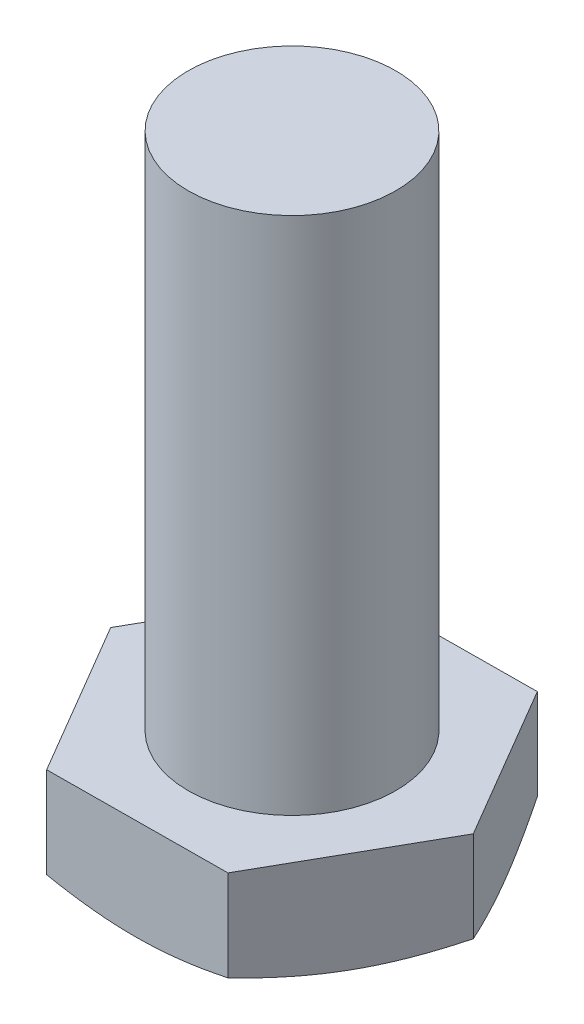
ISO-10303-21;
HEADER;
FILE_DESCRIPTION(('STEP AP214'),'2;1');
FILE_NAME('part.step','',(''),(''),'','','');
FILE_SCHEMA(('AUTOMOTIVE_DESIGN { 1 0 10303 214 1 1 1 1 }'));
ENDSEC;
DATA;
#1=APPLICATION_CONTEXT('core data for automotive mechanical design processes');
#2=APPLICATION_PROTOCOL_DEFINITION('international standard','automotive_design',2000,#1);
#3=PRODUCT_CONTEXT('',#1,'mechanical');
#4=PRODUCT('Part','Part','',(#3));
#5=PRODUCT_RELATED_PRODUCT_CATEGORY('part','',(#4));
#6=PRODUCT_DEFINITION_FORMATION('','',#4);
#7=PRODUCT_DEFINITION_CONTEXT('part definition',#1,'design');
#8=PRODUCT_DEFINITION('design','',#6,#7);
#9=PRODUCT_DEFINITION_SHAPE('','',#8);
#10=(LENGTH_UNIT() NAMED_UNIT(*) SI_UNIT(.MILLI.,.METRE.));
#11=(NAMED_UNIT(*) PLANE_ANGLE_UNIT() SI_UNIT($,.RADIAN.));
#12=(NAMED_UNIT(*) SI_UNIT($,.STERADIAN.) SOLID_ANGLE_UNIT());
#13=UNCERTAINTY_MEASURE_WITH_UNIT(LENGTH_MEASURE(1.E-05),#10,'distance_accuracy_value','');
#14=(GEOMETRIC_REPRESENTATION_CONTEXT(3) GLOBAL_UNCERTAINTY_ASSIGNED_CONTEXT((#13)) GLOBAL_UNIT_ASSIGNED_CONTEXT((#10,
#11,#12)) REPRESENTATION_CONTEXT('',''));
#15=CARTESIAN_POINT('',(0.,0.,0.));
#16=DIRECTION('',(0.,0.,1.));
#17=DIRECTION('',(1.,0.,0.));
#18=AXIS2_PLACEMENT_3D('',#15,#16,#17);
#19=CARTESIAN_POINT('',(6.92800926013698,4.,-0.0518429499176964));
#20=DIRECTION('',(-0.862259714880802,0.,0.506466370150751));
#21=DIRECTION('',(0.506466370150751,0.,0.862259714880802));
#22=AXIS2_PLACEMENT_3D('',#19,#20,#21);
#23=PLANE('',#22);
#24=DIRECTION('',(0.,-1.,0.));
#25=VECTOR('',#24,1.);
#26=CARTESIAN_POINT('',(6.92800926013698,4.,-0.0518429499176964));
#27=LINE('',#26,#25);
#28=CARTESIAN_POINT('',(6.92800926013698,4.,-0.0518429499176964));
#29=VERTEX_POINT('',#28);
#30=CARTESIAN_POINT('',(6.92800926013698,0.499999999999955,-0.0518429499176964));
#31=VERTEX_POINT('',#30);
#32=EDGE_CURVE('E100',#29,#31,#27,.T.);
#33=ORIENTED_EDGE('',*,*,#32,.T.);
#34=CARTESIAN_POINT('',(6.92812673434143,0.500048323854297,-0.0516429499177046));
#35=CARTESIAN_POINT('',(6.80927083368725,0.451153523496953,-0.253995289678116));
#36=CARTESIAN_POINT('',(6.69001316516403,0.405818753398016,-0.457031639806499));
#37=CARTESIAN_POINT('',(6.45068704253087,0.323588255555171,-0.864484703676812));
#38=CARTESIAN_POINT('',(6.33061816090486,0.286697404628385,-1.06890214526545));
#39=CARTESIAN_POINT('',(6.08980212413212,0.222733872218398,-1.47889179007559));
#40=CARTESIAN_POINT('',(5.96905498410254,0.195660972785808,-1.68446396756013));
#41=CARTESIAN_POINT('',(5.72707612635943,0.152526784459337,-2.09643331672472));
#42=CARTESIAN_POINT('',(5.60584451749911,0.136463148037688,-2.30283030308202));
#43=CARTESIAN_POINT('',(5.36527958055234,0.116319318782393,-2.71239245008163));
#44=CARTESIAN_POINT('',(5.24595077926599,0.112031358764849,-2.91554990384033));
#45=CARTESIAN_POINT('',(5.00732161217629,0.115061975267654,-3.32181639990751));
#46=CARTESIAN_POINT('',(4.8880212494557,0.122381491112353,-3.52492543696759));
#47=CARTESIAN_POINT('',(4.64982253013155,0.148247832990973,-3.93045909510224));
#48=CARTESIAN_POINT('',(4.53092395123452,0.166786827535181,-4.13288409463177));
#49=CARTESIAN_POINT('',(4.29367346446322,0.214215666129992,-4.53680338549773));
#50=CARTESIAN_POINT('',(4.17532150449906,0.243104502384013,-4.73829776551728));
#51=CARTESIAN_POINT('',(4.00393845593336,0.291718667390088,-5.03007764923923));
#52=CARTESIAN_POINT('',(3.95063367882227,0.307796950885785,-5.12082910801805));
#53=CARTESIAN_POINT('',(3.8441748819999,0.341709113385547,-5.30207536088827));
#54=CARTESIAN_POINT('',(3.79102084121377,0.35954273311736,-5.39257019085966));
#55=CARTESIAN_POINT('',(3.68463447785271,0.396928978859127,-5.57369312565906));
#56=CARTESIAN_POINT('',(3.63140279074218,0.416488622266113,-5.66432014860807));
#57=CARTESIAN_POINT('',(3.52508546419802,0.457145192961709,-5.84532554812862));
#58=CARTESIAN_POINT('',(3.47199983731745,0.478242248347747,-5.93570390332856));
#59=CARTESIAN_POINT('',(3.4189898442282,0.500048323854307,-6.02595349189131));
#60=B_SPLINE_CURVE_WITH_KNOTS('',3,(#34,#35,#36,#37,#38,#39,#40,#41,#42,#43,#44,#45,#46,#47,#48,
#49,#50,#51,#52,#53,#54,#55,#56,#57,#58,#59),.UNSPECIFIED.,.F.,.F.,(4,2,2,2,2,2,2,2,2,2,2,2,4),
(0.,0.71919702680669,1.43880838629071,2.15840377009404,2.87784566531589,3.58450976947285,
4.29123106269326,4.99745961403513,5.70361941636778,6.02301671113098,6.34236689985319,
6.6630812028558,6.98382225844898),.UNSPECIFIED.);
#61=CARTESIAN_POINT('',(3.41910731843264,0.499999999999969,-6.02575349189131));
#62=VERTEX_POINT('',#61);
#63=EDGE_CURVE('E51',#31,#62,#60,.T.);
#64=ORIENTED_EDGE('',*,*,#63,.T.);
#65=DIRECTION('',(0.,-1.,0.));
#66=VECTOR('',#65,1.);
#67=CARTESIAN_POINT('',(3.41910731843264,4.,-6.02575349189131));
#68=LINE('',#67,#66);
#69=CARTESIAN_POINT('',(3.41910731843264,4.,-6.02575349189131));
#70=VERTEX_POINT('',#69);
#71=EDGE_CURVE('E11',#70,#62,#68,.T.);
#72=ORIENTED_EDGE('',*,*,#71,.F.);
#73=DIRECTION('',(-0.506466370150751,0.,-0.862259714880802));
#74=VECTOR('',#73,1.);
#75=CARTESIAN_POINT('',(6.92800926013698,4.,-0.0518429499176964));
#76=LINE('',#75,#74);
#77=EDGE_CURVE('E107',#29,#70,#76,.T.);
#78=ORIENTED_EDGE('',*,*,#77,.F.);
#79=EDGE_LOOP('',(#33,#64,#72,#78));
#80=FACE_BOUND('',#79,.T.);
#81=ADVANCED_FACE('F36',(#80),#23,.F.);
#82=CARTESIAN_POINT('',(3.41910731843264,4.,-6.02575349189131));
#83=DIRECTION('',(0.00748288527264197,0.,0.999972002822077));
#84=DIRECTION('',(0.999972002822077,0.,-0.00748288527264197));
#85=AXIS2_PLACEMENT_3D('',#82,#83,#84);
#86=PLANE('',#85);
#87=ORIENTED_EDGE('',*,*,#71,.T.);
#88=CARTESIAN_POINT('',(3.41930731843264,0.500041668735365,-6.02575498851027));
#89=CARTESIAN_POINT('',(3.18463793493822,0.451147379088578,-6.02399893527204));
#90=CARTESIAN_POINT('',(2.94917530203572,0.405813123250812,-6.02223694607332));
#91=CARTESIAN_POINT('',(2.47664923052112,0.323583645094771,-6.01870098869501));
#92=CARTESIAN_POINT('',(2.23958494783807,0.286693299516301,-6.01692701419917));
#93=CARTESIAN_POINT('',(1.76411722102667,0.222730752709938,-6.01336904413548));
#94=CARTESIAN_POINT('',(1.52571380679544,0.195658333167209,-6.01158504879135));
#95=CARTESIAN_POINT('',(1.04795024501058,0.152525053498622,-6.00800989877695));
#96=CARTESIAN_POINT('',(0.808590312370648,0.136461845881854,-6.00621874571491));
#97=CARTESIAN_POINT('',(0.333618388488675,0.116318789353803,-6.00266448579152));
#98=CARTESIAN_POINT('',(0.0980153345379292,0.112031176860927,-6.00090144580878));
#99=CARTESIAN_POINT('',(-0.373134615199054,0.115062400399776,-5.99737578608017));
#100=CARTESIAN_POINT('',(-0.608681504897423,0.122382175753056,-5.99561316637985));
#101=CARTESIAN_POINT('',(-1.07898155645899,0.148248938632609,-5.99209386651983));
#102=CARTESIAN_POINT('',(-1.3137351572167,0.166788094893103,-5.99033718307585));
#103=CARTESIAN_POINT('',(-1.78216300726955,0.214217160166547,-5.98683189307716));
#104=CARTESIAN_POINT('',(-2.01583735941227,0.243106061383196,-5.98508328575284));
#105=CARTESIAN_POINT('',(-2.35421319805392,0.291719797015002,-5.98255118728164));
#106=CARTESIAN_POINT('',(-2.45945506356584,0.307797563816831,-5.98176365242739));
#107=CARTESIAN_POINT('',(-2.66964115748647,0.341708573083566,-5.98019080996553));
#108=CARTESIAN_POINT('',(-2.774585427503,0.359541556292345,-5.97940550204657));
#109=CARTESIAN_POINT('',(-2.98462851415085,0.39692641493938,-5.97783372972168));
#110=CARTESIAN_POINT('',(-3.08972607625419,0.416485307019949,-5.9770472747035));
#111=CARTESIAN_POINT('',(-3.29963286330454,0.457140277774729,-5.97547652232142));
#112=CARTESIAN_POINT('',(-3.40444206346648,0.478236484548056,-5.97469222514298));
#113=CARTESIAN_POINT('',(-3.50910194170434,0.500041668735351,-5.97390904535465));
#114=B_SPLINE_CURVE_WITH_KNOTS('',3,(#88,#89,#90,#91,#92,#93,#94,#95,#96,#97,#98,#99,#100,#101,
#102,#103,#104,#105,#106,#107,#108,#109,#110,#111,#112,#113),.UNSPECIFIED.,.F.,.F.,(4,2,2,2,2,2,
2,2,2,2,2,2,4),(0.,0.719194265188102,1.43880285535953,2.15839544308146,2.87783454451759,
3.58449604508288,4.29121473476451,4.99744069417608,5.70359790420751,6.02298431424008,
6.34232361955401,6.66302693575096,6.98375700567054),.UNSPECIFIED.);
#115=CARTESIAN_POINT('',(-3.50890194170433,0.499999999999959,-5.97391054197362));
#116=VERTEX_POINT('',#115);
#117=EDGE_CURVE('E88',#62,#116,#114,.T.);
#118=ORIENTED_EDGE('',*,*,#117,.T.);
#119=DIRECTION('',(0.,-1.,0.));
#120=VECTOR('',#119,1.);
#121=CARTESIAN_POINT('',(-3.50890194170434,4.,-5.97391054197362));
#122=LINE('',#121,#120);
#123=CARTESIAN_POINT('',(-3.50890194170434,4.,-5.97391054197362));
#124=VERTEX_POINT('',#123);
#125=EDGE_CURVE('E44',#124,#116,#122,.T.);
#126=ORIENTED_EDGE('',*,*,#125,.F.);
#127=DIRECTION('',(-0.999972002822077,0.,0.00748288527264197));
#128=VECTOR('',#127,1.);
#129=CARTESIAN_POINT('',(3.41910731843264,4.,-6.02575349189131));
#130=LINE('',#129,#128);
#131=EDGE_CURVE('E104',#70,#124,#130,.T.);
#132=ORIENTED_EDGE('',*,*,#131,.F.);
#133=EDGE_LOOP('',(#87,#118,#126,#132));
#134=FACE_BOUND('',#133,.T.);
#135=ADVANCED_FACE('F103',(#134),#86,.F.);
#136=CARTESIAN_POINT('',(-3.50890194170434,4.,-5.97391054197362));
#137=DIRECTION('',(0.869742600153445,0.,0.493505632671326));
#138=DIRECTION('',(0.493505632671326,0.,-0.869742600153445));
#139=AXIS2_PLACEMENT_3D('',#136,#137,#138);
#140=PLANE('',#139);
#141=ORIENTED_EDGE('',*,*,#125,.T.);
#142=CARTESIAN_POINT('',(-3.50878845855827,0.50004790808662,-5.97411054197361));
#143=CARTESIAN_POINT('',(-3.624602749278,0.45115313963507,-5.77000218803191));
#144=CARTESIAN_POINT('',(-3.74080852626781,0.405818401663737,-5.56520388799047));
#145=CARTESIAN_POINT('',(-3.97401011688449,0.323587967524099,-5.15421494611155));
#146=CARTESIAN_POINT('',(-4.09100634708643,0.286697148168085,-4.94802357011208));
#147=CARTESIAN_POINT('',(-4.32565972276912,0.222733677331985,-4.5344760367307));
#148=CARTESIAN_POINT('',(-4.44331685351804,0.195660807879679,-4.3271199053118));
#149=CARTESIAN_POINT('',(-4.67910329144384,0.152526676320006,-3.91157548995742));
#150=CARTESIAN_POINT('',(-4.79723249255332,0.136463066687173,-3.70338739295258));
#151=CARTESIAN_POINT('',(-5.03164119328928,0.116319285706588,-3.29027106888326));
#152=CARTESIAN_POINT('',(-5.14791628197317,0.112031347399988,-3.08535061555917));
#153=CARTESIAN_POINT('',(-5.38043875107804,0.115062001826173,-2.67555854129514));
#154=CARTESIAN_POINT('',(-5.49668612849511,0.122381533883134,-2.47068692564921));
#155=CARTESIAN_POINT('',(-5.72878916466055,0.148247902062853,-2.06163405003091));
#156=CARTESIAN_POINT('',(-5.84464504001367,0.166786906709888,-1.85745240831946));
#157=CARTESIAN_POINT('',(-6.07582410932302,0.214215759465787,-1.45002790993267));
#158=CARTESIAN_POINT('',(-6.19114735403614,0.243104599778086,-1.24678496380457));
#159=CARTESIAN_POINT('',(-6.35814448332842,0.291718737959834,-0.95247319138847));
#160=CARTESIAN_POINT('',(-6.4100850527656,0.307796989176172,-0.860934366043753));
#161=CARTESIAN_POINT('',(-6.5138192928088,0.341709079630011,-0.678115606363659));
#162=CARTESIAN_POINT('',(-6.56561298395029,0.359542659596266,-0.586835635837061));
#163=CARTESIAN_POINT('',(-6.66927664432829,0.396928818681863,-0.404141264081769));
#164=CARTESIAN_POINT('',(-6.72114599436656,0.416488415151085,-0.312727954113328));
#165=CARTESIAN_POINT('',(-6.82474238484224,0.457144885893216,-0.130152137235407));
#166=CARTESIAN_POINT('',(-6.87646941304781,0.478241888263657,-0.0389896518830002));
#167=CARTESIAN_POINT('',(-6.92812274328304,0.500047908086592,0.0520429499177022));
#168=B_SPLINE_CURVE_WITH_KNOTS('',3,(#142,#143,#144,#145,#146,#147,#148,#149,#150,#151,#152,
#153,#154,#155,#156,#157,#158,#159,#160,#161,#162,#163,#164,#165,#166,#167),.UNSPECIFIED.,.F.,
.F.,(4,2,2,2,2,2,2,2,2,2,2,2,4),(0.,0.719196854278306,1.43880804075327,2.1584032498752,
2.87784497055906,3.58450891206013,4.29123004262796,4.99745843204247,5.70361807242459,
6.0230146871868,6.34236419599061,6.66307781261516,6.98381818190101),.UNSPECIFIED.);
#169=CARTESIAN_POINT('',(-6.92800926013699,0.499999999999931,0.0518429499176826));
#170=VERTEX_POINT('',#169);
#171=EDGE_CURVE('E91',#116,#170,#168,.T.);
#172=ORIENTED_EDGE('',*,*,#171,.T.);
#173=DIRECTION('',(0.,-1.,0.));
#174=VECTOR('',#173,1.);
#175=CARTESIAN_POINT('',(-6.92800926013697,4.,0.0518429499176964));
#176=LINE('',#175,#174);
#177=CARTESIAN_POINT('',(-6.92800926013697,4.,0.0518429499176964));
#178=VERTEX_POINT('',#177);
#179=EDGE_CURVE('E129',#178,#170,#176,.T.);
#180=ORIENTED_EDGE('',*,*,#179,.F.);
#181=DIRECTION('',(-0.493505632671326,0.,0.869742600153445));
#182=VECTOR('',#181,1.);
#183=CARTESIAN_POINT('',(-3.50890194170434,4.,-5.97391054197362));
#184=LINE('',#183,#182);
#185=EDGE_CURVE('E106',#124,#178,#184,.T.);
#186=ORIENTED_EDGE('',*,*,#185,.F.);
#187=EDGE_LOOP('',(#141,#172,#180,#186));
#188=FACE_BOUND('',#187,.T.);
#189=ADVANCED_FACE('F132',(#188),#140,.F.);
#190=CARTESIAN_POINT('',(-6.92800926013697,4.,0.0518429499176964));
#191=DIRECTION('',(0.862259714880802,0.,-0.506466370150751));
#192=DIRECTION('',(-0.506466370150751,0.,-0.862259714880802));
#193=AXIS2_PLACEMENT_3D('',#190,#191,#192);
#194=PLANE('',#193);
#195=ORIENTED_EDGE('',*,*,#179,.T.);
#196=CARTESIAN_POINT('',(-6.92812673434142,0.500048323854266,0.0516429499177046));
#197=CARTESIAN_POINT('',(-6.80927083368724,0.451153523496923,0.253995289678117));
#198=CARTESIAN_POINT('',(-6.69001316516403,0.405818753397986,0.457031639806499));
#199=CARTESIAN_POINT('',(-6.45068704253086,0.323588255555139,0.864484703676813));
#200=CARTESIAN_POINT('',(-6.33061816090485,0.286697404628352,1.06890214526545));
#201=CARTESIAN_POINT('',(-6.08980212413211,0.222733872218363,1.47889179007559));
#202=CARTESIAN_POINT('',(-5.96905498410252,0.195660972785772,1.68446396756013));
#203=CARTESIAN_POINT('',(-5.72707612635942,0.152526784459301,2.09643331672472));
#204=CARTESIAN_POINT('',(-5.6058445174991,0.136463148037652,2.30283030308202));
#205=CARTESIAN_POINT('',(-5.36527958055232,0.116319318782355,2.71239245008164));
#206=CARTESIAN_POINT('',(-5.24595077926598,0.11203135876481,2.91554990384033));
#207=CARTESIAN_POINT('',(-5.00732161217628,0.115061975267614,3.32181639990751));
#208=CARTESIAN_POINT('',(-4.88802124945568,0.122381491112312,3.52492543696759));
#209=CARTESIAN_POINT('',(-4.64982253013153,0.148247832990931,3.93045909510225));
#210=CARTESIAN_POINT('',(-4.5309239512345,0.166786827535138,4.13288409463177));
#211=CARTESIAN_POINT('',(-4.2936734644632,0.214215666129948,4.53680338549774));
#212=CARTESIAN_POINT('',(-4.17532150449905,0.243104502383969,4.73829776551729));
#213=CARTESIAN_POINT('',(-4.00393845593335,0.291718667390043,5.03007764923924));
#214=CARTESIAN_POINT('',(-3.95063367882225,0.307796950885739,5.12082910801806));
#215=CARTESIAN_POINT('',(-3.84417488199989,0.341709113385501,5.30207536088828));
#216=CARTESIAN_POINT('',(-3.79102084121375,0.359542733117313,5.39257019085967));
#217=CARTESIAN_POINT('',(-3.6846344778527,0.39692897885908,5.57369312565908));
#218=CARTESIAN_POINT('',(-3.63140279074216,0.416488622266066,5.66432014860808));
#219=CARTESIAN_POINT('',(-3.525085464198,0.457145192961661,5.84532554812863));
#220=CARTESIAN_POINT('',(-3.47199983731743,0.478242248347697,5.93570390332857));
#221=CARTESIAN_POINT('',(-3.41898984422818,0.500048323854255,6.02595349189132));
#222=B_SPLINE_CURVE_WITH_KNOTS('',3,(#196,#197,#198,#199,#200,#201,#202,#203,#204,#205,#206,
#207,#208,#209,#210,#211,#212,#213,#214,#215,#216,#217,#218,#219,#220,#221),.UNSPECIFIED.,.F.,
.F.,(4,2,2,2,2,2,2,2,2,2,2,2,4),(0.,0.719197026806691,1.43880838629071,2.15840377009404,
2.87784566531589,3.58450976947285,4.29123106269327,4.99745961403514,5.70361941636779,
6.02301671113099,6.3423668998532,6.66308120285581,6.98382225844899),.UNSPECIFIED.);
#223=CARTESIAN_POINT('',(-3.41910731843265,0.499999999999921,6.02575349189131));
#224=VERTEX_POINT('',#223);
#225=EDGE_CURVE('E141',#170,#224,#222,.T.);
#226=ORIENTED_EDGE('',*,*,#225,.T.);
#227=DIRECTION('',(0.,-1.,0.));
#228=VECTOR('',#227,1.);
#229=CARTESIAN_POINT('',(-3.41910731843263,4.,6.02575349189131));
#230=LINE('',#229,#228);
#231=CARTESIAN_POINT('',(-3.41910731843263,4.,6.02575349189131));
#232=VERTEX_POINT('',#231);
#233=EDGE_CURVE('E126',#232,#224,#230,.T.);
#234=ORIENTED_EDGE('',*,*,#233,.F.);
#235=DIRECTION('',(0.506466370150751,0.,0.862259714880802));
#236=VECTOR('',#235,1.);
#237=CARTESIAN_POINT('',(-6.92800926013697,4.,0.0518429499176964));
#238=LINE('',#237,#236);
#239=EDGE_CURVE('E117',#178,#232,#238,.T.);
#240=ORIENTED_EDGE('',*,*,#239,.F.);
#241=EDGE_LOOP('',(#195,#226,#234,#240));
#242=FACE_BOUND('',#241,.T.);
#243=ADVANCED_FACE('F140',(#242),#194,.F.);
#244=CARTESIAN_POINT('',(-3.41910731843263,4.,6.02575349189131));
#245=DIRECTION('',(-0.00748288527264222,0.,-0.999972002822077));
#246=DIRECTION('',(-0.999972002822077,0.,0.00748288527264222));
#247=AXIS2_PLACEMENT_3D('',#244,#245,#246);
#248=PLANE('',#247);
#249=ORIENTED_EDGE('',*,*,#233,.T.);
#250=CARTESIAN_POINT('',(-3.41930731843263,0.500041668735313,6.02575498851027));
#251=CARTESIAN_POINT('',(-3.18463793493821,0.451147379088528,6.02399893527204));
#252=CARTESIAN_POINT('',(-2.94917530203571,0.405813123250764,6.02223694607331));
#253=CARTESIAN_POINT('',(-2.47664923052111,0.323583645094725,6.01870098869501));
#254=CARTESIAN_POINT('',(-2.23958494783806,0.286693299516255,6.01692701419917));
#255=CARTESIAN_POINT('',(-1.76411722102666,0.222730752709894,6.01336904413548));
#256=CARTESIAN_POINT('',(-1.52571380679543,0.195658333167167,6.01158504879135));
#257=CARTESIAN_POINT('',(-1.04795024501057,0.152525053498582,6.00800989877695));
#258=CARTESIAN_POINT('',(-0.808590312370637,0.136461845881814,6.00621874571491));
#259=CARTESIAN_POINT('',(-0.333618388488663,0.116318789353766,6.00266448579152));
#260=CARTESIAN_POINT('',(-0.0980153345379173,0.112031176860891,6.00090144580878));
#261=CARTESIAN_POINT('',(0.373134615199066,0.115062400399742,5.99737578608017));
#262=CARTESIAN_POINT('',(0.608681504897436,0.122382175753022,5.99561316637985));
#263=CARTESIAN_POINT('',(1.078981556459,0.148248938632578,5.99209386651983));
#264=CARTESIAN_POINT('',(1.31373515721671,0.166788094893074,5.99033718307584));
#265=CARTESIAN_POINT('',(1.78216300726956,0.214217160166517,5.98683189307716));
#266=CARTESIAN_POINT('',(2.01583735941228,0.243106061383161,5.98508328575286));
#267=CARTESIAN_POINT('',(2.35421319805393,0.291719797014972,5.98255118728165));
#268=CARTESIAN_POINT('',(2.45945506356585,0.307797563816805,5.98176365242739));
#269=CARTESIAN_POINT('',(2.66964115748648,0.341708573083541,5.98019080996552));
#270=CARTESIAN_POINT('',(2.77458542750301,0.35954155629232,5.97940550204656));
#271=CARTESIAN_POINT('',(2.98462851415086,0.396926414939355,5.97783372972168));
#272=CARTESIAN_POINT('',(3.0897260762542,0.416485307019925,5.9770472747035));
#273=CARTESIAN_POINT('',(3.29963286330455,0.457140277774706,5.97547652232142));
#274=CARTESIAN_POINT('',(3.40444206346649,0.478236484548032,5.97469222514299));
#275=CARTESIAN_POINT('',(3.50910194170435,0.500041668735327,5.97390904535466));
#276=B_SPLINE_CURVE_WITH_KNOTS('',3,(#250,#251,#252,#253,#254,#255,#256,#257,#258,#259,#260,
#261,#262,#263,#264,#265,#266,#267,#268,#269,#270,#271,#272,#273,#274,#275),.UNSPECIFIED.,.F.,
.F.,(4,2,2,2,2,2,2,2,2,2,2,2,4),(0.,0.7191942651881,1.43880285535953,2.15839544308146,
2.87783454451759,3.58449604508289,4.29121473476451,4.99744069417608,5.70359790420751,
6.02298431424008,6.34232361955401,6.66302693575096,6.98375700567055),.UNSPECIFIED.);
#277=CARTESIAN_POINT('',(3.50890194170434,0.499999999999931,5.97391054197362));
#278=VERTEX_POINT('',#277);
#279=EDGE_CURVE('E145',#224,#278,#276,.T.);
#280=ORIENTED_EDGE('',*,*,#279,.T.);
#281=DIRECTION('',(0.,-1.,0.));
#282=VECTOR('',#281,1.);
#283=CARTESIAN_POINT('',(3.50890194170434,4.,5.97391054197362));
#284=LINE('',#283,#282);
#285=CARTESIAN_POINT('',(3.50890194170434,4.,5.97391054197362));
#286=VERTEX_POINT('',#285);
#287=EDGE_CURVE('E123',#286,#278,#284,.T.);
#288=ORIENTED_EDGE('',*,*,#287,.F.);
#289=DIRECTION('',(0.999972002822077,0.,-0.00748288527264222));
#290=VECTOR('',#289,1.);
#291=CARTESIAN_POINT('',(-3.41910731843263,4.,6.02575349189131));
#292=LINE('',#291,#290);
#293=EDGE_CURVE('E119',#232,#286,#292,.T.);
#294=ORIENTED_EDGE('',*,*,#293,.F.);
#295=EDGE_LOOP('',(#249,#280,#288,#294));
#296=FACE_BOUND('',#295,.T.);
#297=ADVANCED_FACE('F144',(#296),#248,.F.);
#298=CARTESIAN_POINT('',(3.50890194170434,4.,5.97391054197362));
#299=DIRECTION('',(-0.869742600153445,0.,-0.493505632671326));
#300=DIRECTION('',(-0.493505632671326,0.,0.869742600153445));
#301=AXIS2_PLACEMENT_3D('',#298,#299,#300);
#302=PLANE('',#301);
#303=ORIENTED_EDGE('',*,*,#287,.T.);
#304=CARTESIAN_POINT('',(3.50878845855828,0.500047908086595,5.97411054197361));
#305=CARTESIAN_POINT('',(3.624602749278,0.451153139635048,5.77000218803191));
#306=CARTESIAN_POINT('',(3.74080852626781,0.405818401663717,5.56520388799046));
#307=CARTESIAN_POINT('',(3.9740101168845,0.323587967524084,5.15421494611155));
#308=CARTESIAN_POINT('',(4.09100634708644,0.286697148168073,4.94802357011208));
#309=CARTESIAN_POINT('',(4.32565972276913,0.222733677331977,4.5344760367307));
#310=CARTESIAN_POINT('',(4.44331685351805,0.195660807879672,4.3271199053118));
#311=CARTESIAN_POINT('',(4.67910329144384,0.152526676320001,3.91157548995743));
#312=CARTESIAN_POINT('',(4.79723249255333,0.13646306668717,3.70338739295258));
#313=CARTESIAN_POINT('',(5.03164119328929,0.116319285706589,3.29027106888326));
#314=CARTESIAN_POINT('',(5.14791628197318,0.11203134739999,3.08535061555918));
#315=CARTESIAN_POINT('',(5.38043875107804,0.115062001826179,2.67555854129515));
#316=CARTESIAN_POINT('',(5.49668612849511,0.122381533883142,2.47068692564922));
#317=CARTESIAN_POINT('',(5.72878916466055,0.148247902062863,2.06163405003091));
#318=CARTESIAN_POINT('',(5.84464504001367,0.166786906709898,1.85745240831947));
#319=CARTESIAN_POINT('',(6.07582410932302,0.214215759465802,1.45002790993268));
#320=CARTESIAN_POINT('',(6.19114735403615,0.243104599778107,1.24678496380458));
#321=CARTESIAN_POINT('',(6.35814448332843,0.291718737959855,0.952473191388482));
#322=CARTESIAN_POINT('',(6.4100850527656,0.307796989176193,0.860934366043762));
#323=CARTESIAN_POINT('',(6.5138192928088,0.341709079630032,0.678115606363665));
#324=CARTESIAN_POINT('',(6.5656129839503,0.359542659596288,0.586835635837066));
#325=CARTESIAN_POINT('',(6.6692766443283,0.396928818681887,0.404141264081772));
#326=CARTESIAN_POINT('',(6.72114599436657,0.41648841515111,0.312727954113331));
#327=CARTESIAN_POINT('',(6.82474238484224,0.457144885893242,0.130152137235408));
#328=CARTESIAN_POINT('',(6.87646941304782,0.478241888263684,0.0389896518830003));
#329=CARTESIAN_POINT('',(6.92812274328305,0.50004790808662,-0.0520429499177022));
#330=B_SPLINE_CURVE_WITH_KNOTS('',3,(#304,#305,#306,#307,#308,#309,#310,#311,#312,#313,#314,
#315,#316,#317,#318,#319,#320,#321,#322,#323,#324,#325,#326,#327,#328,#329),.UNSPECIFIED.,.F.,
.F.,(4,2,2,2,2,2,2,2,2,2,2,2,4),(0.,0.719196854278305,1.43880804075327,2.15840324987519,
2.87784497055905,3.58450891206012,4.29123004262795,4.99745843204246,5.70361807242458,
6.02301468718678,6.3423641959906,6.66307781261515,6.98381818190101),.UNSPECIFIED.);
#331=EDGE_CURVE('E148',#278,#31,#330,.T.);
#332=ORIENTED_EDGE('',*,*,#331,.T.);
#333=ORIENTED_EDGE('',*,*,#32,.F.);
#334=DIRECTION('',(0.493505632671326,0.,-0.869742600153445));
#335=VECTOR('',#334,1.);
#336=CARTESIAN_POINT('',(3.50890194170434,4.,5.97391054197362));
#337=LINE('',#336,#335);
#338=EDGE_CURVE('E59',#286,#29,#337,.T.);
#339=ORIENTED_EDGE('',*,*,#338,.F.);
#340=EDGE_LOOP('',(#303,#332,#333,#339));
#341=FACE_BOUND('',#340,.T.);
#342=ADVANCED_FACE('F147',(#341),#302,.F.);
#343=CARTESIAN_POINT('',(0.,4.,0.));
#344=DIRECTION('',(0.,1.,0.));
#345=DIRECTION('',(0.,0.,1.));
#346=AXIS2_PLACEMENT_3D('',#343,#344,#345);
#347=PLANE('',#346);
#348=CARTESIAN_POINT('',(0.,4.,0.));
#349=DIRECTION('',(0.,1.,0.));
#350=DIRECTION('',(0.,0.,1.));
#351=AXIS2_PLACEMENT_3D('',#348,#349,#350);
#352=CIRCLE('',#351,4.);
#353=CARTESIAN_POINT('',(0.,4.,4.));
#354=VERTEX_POINT('',#353);
#355=EDGE_CURVE('E101',#354,#354,#352,.T.);
#356=ORIENTED_EDGE('',*,*,#355,.F.);
#357=EDGE_LOOP('',(#356));
#358=FACE_BOUND('',#357,.T.);
#359=ORIENTED_EDGE('',*,*,#77,.T.);
#360=ORIENTED_EDGE('',*,*,#131,.T.);
#361=ORIENTED_EDGE('',*,*,#185,.T.);
#362=ORIENTED_EDGE('',*,*,#239,.T.);
#363=ORIENTED_EDGE('',*,*,#293,.T.);
#364=ORIENTED_EDGE('',*,*,#338,.T.);
#365=EDGE_LOOP('',(#359,#360,#361,#362,#363,#364));
#366=FACE_BOUND('',#365,.T.);
#367=ADVANCED_FACE('F109',(#358,#366),#347,.T.);
#368=CARTESIAN_POINT('',(0.,24.,0.));
#369=DIRECTION('',(0.,-1.,0.));
#370=DIRECTION('',(0.,0.,-1.));
#371=AXIS2_PLACEMENT_3D('',#368,#369,#370);
#372=CYLINDRICAL_SURFACE('',#371,4.);
#373=CARTESIAN_POINT('',(0.,24.,0.));
#374=DIRECTION('',(0.,1.,0.));
#375=DIRECTION('',(0.,0.,1.));
#376=AXIS2_PLACEMENT_3D('',#373,#374,#375);
#377=CIRCLE('',#376,4.);
#378=CARTESIAN_POINT('',(0.,24.,4.));
#379=VERTEX_POINT('',#378);
#380=EDGE_CURVE('E110',#379,#379,#377,.T.);
#381=ORIENTED_EDGE('',*,*,#380,.F.);
#382=EDGE_LOOP('',(#381));
#383=FACE_BOUND('',#382,.T.);
#384=ORIENTED_EDGE('',*,*,#355,.T.);
#385=EDGE_LOOP('',(#384));
#386=FACE_BOUND('',#385,.T.);
#387=ADVANCED_FACE('F241',(#383,#386),#372,.T.);
#388=CARTESIAN_POINT('',(0.,24.,0.));
#389=DIRECTION('',(0.,1.,0.));
#390=DIRECTION('',(0.,0.,1.));
#391=AXIS2_PLACEMENT_3D('',#388,#389,#390);
#392=PLANE('',#391);
#393=ORIENTED_EDGE('',*,*,#380,.T.);
#394=EDGE_LOOP('',(#393));
#395=FACE_BOUND('',#394,.T.);
#396=ADVANCED_FACE('F170',(#395),#392,.T.);
#397=CARTESIAN_POINT('',(0.,0.499999999999945,0.));
#398=DIRECTION('',(0.,1.,0.));
#399=DIRECTION('',(0.,0.,1.));
#400=AXIS2_PLACEMENT_3D('',#397,#398,#399);
#401=CONICAL_SURFACE('',#400,6.92820323027551,1.17600520709517);
#402=CARTESIAN_POINT('',(0.,0.,0.));
#403=DIRECTION('',(0.,-1.,0.));
#404=DIRECTION('',(0.,0.,-1.));
#405=AXIS2_PLACEMENT_3D('',#402,#403,#404);
#406=CIRCLE('',#405,5.72820323027551);
#407=CARTESIAN_POINT('',(0.,0.,-5.72820323027551));
#408=VERTEX_POINT('',#407);
#409=EDGE_CURVE('E149',#408,#408,#406,.T.);
#410=ORIENTED_EDGE('',*,*,#409,.F.);
#411=EDGE_LOOP('',(#410));
#412=FACE_BOUND('',#411,.T.);
#413=ORIENTED_EDGE('',*,*,#331,.F.);
#414=ORIENTED_EDGE('',*,*,#279,.F.);
#415=ORIENTED_EDGE('',*,*,#225,.F.);
#416=ORIENTED_EDGE('',*,*,#171,.F.);
#417=ORIENTED_EDGE('',*,*,#117,.F.);
#418=ORIENTED_EDGE('',*,*,#63,.F.);
#419=EDGE_LOOP('',(#413,#414,#415,#416,#417,#418));
#420=FACE_BOUND('',#419,.T.);
#421=ADVANCED_FACE('F89',(#412,#420),#401,.T.);
#422=CARTESIAN_POINT('',(0.,0.,0.));
#423=DIRECTION('',(0.,1.,0.));
#424=DIRECTION('',(0.,0.,1.));
#425=AXIS2_PLACEMENT_3D('',#422,#423,#424);
#426=PLANE('',#425);
#427=ORIENTED_EDGE('',*,*,#409,.T.);
#428=EDGE_LOOP('',(#427));
#429=FACE_BOUND('',#428,.T.);
#430=ADVANCED_FACE('F169',(#429),#426,.F.);
#431=CLOSED_SHELL('',(#81,#135,#189,#243,#297,#342,#367,#387,#396,#421,#430));
#432=MANIFOLD_SOLID_BREP('B2',#431);
#433=ADVANCED_BREP_SHAPE_REPRESENTATION('',(#18,#432),#14);
#434=SHAPE_DEFINITION_REPRESENTATION(#9,#433);
ENDSEC;
END-ISO-10303-21;
